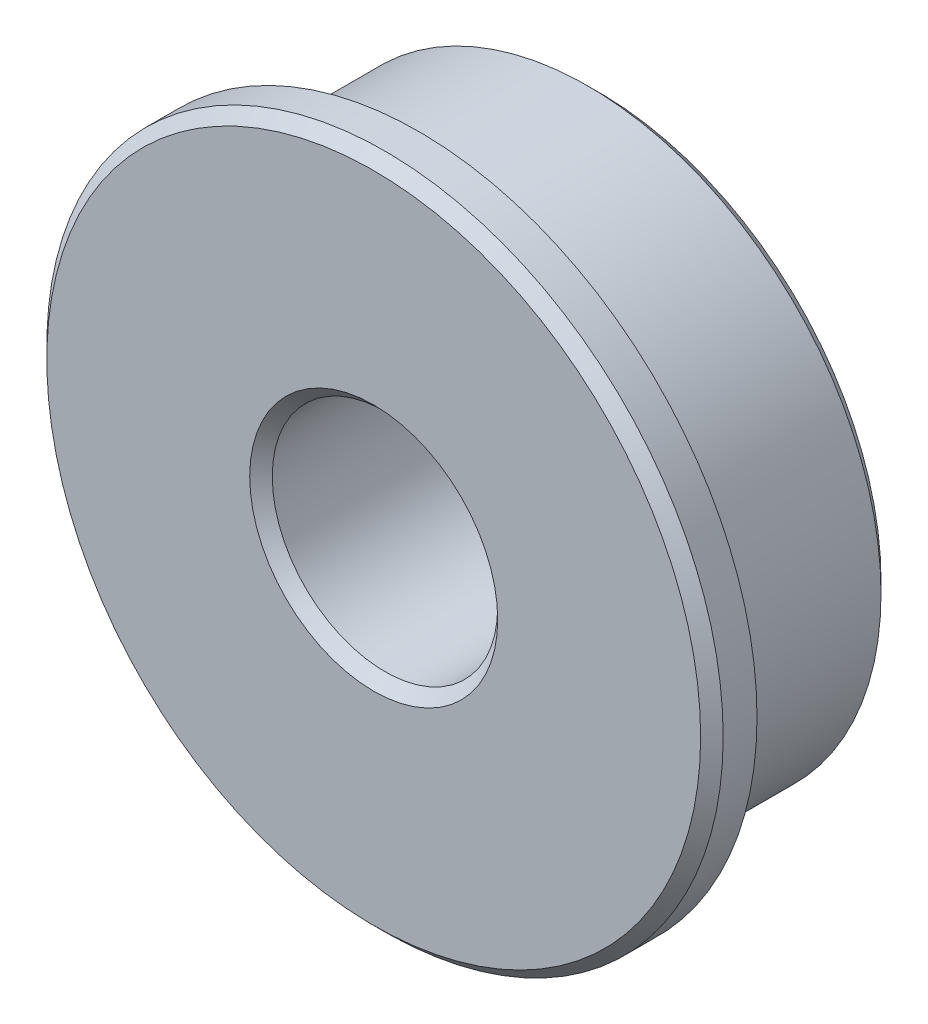
ISO-10303-21;
HEADER;
FILE_DESCRIPTION(('STEP AP214'),'2;1');
FILE_NAME('part.step','',(''),(''),'','','');
FILE_SCHEMA(('AUTOMOTIVE_DESIGN { 1 0 10303 214 1 1 1 1 }'));
ENDSEC;
DATA;
#1=APPLICATION_CONTEXT('core data for automotive mechanical design processes');
#2=APPLICATION_PROTOCOL_DEFINITION('international standard','automotive_design',2000,#1);
#3=PRODUCT_CONTEXT('',#1,'mechanical');
#4=PRODUCT('Part','Part','',(#3));
#5=PRODUCT_RELATED_PRODUCT_CATEGORY('part','',(#4));
#6=PRODUCT_DEFINITION_FORMATION('','',#4);
#7=PRODUCT_DEFINITION_CONTEXT('part definition',#1,'design');
#8=PRODUCT_DEFINITION('design','',#6,#7);
#9=PRODUCT_DEFINITION_SHAPE('','',#8);
#10=(LENGTH_UNIT() NAMED_UNIT(*) SI_UNIT(.MILLI.,.METRE.));
#11=(NAMED_UNIT(*) PLANE_ANGLE_UNIT() SI_UNIT($,.RADIAN.));
#12=(NAMED_UNIT(*) SI_UNIT($,.STERADIAN.) SOLID_ANGLE_UNIT());
#13=UNCERTAINTY_MEASURE_WITH_UNIT(LENGTH_MEASURE(1.E-05),#10,'distance_accuracy_value','');
#14=(GEOMETRIC_REPRESENTATION_CONTEXT(3) GLOBAL_UNCERTAINTY_ASSIGNED_CONTEXT((#13)) GLOBAL_UNIT_ASSIGNED_CONTEXT((#10,
#11,#12)) REPRESENTATION_CONTEXT('',''));
#15=CARTESIAN_POINT('',(0.,0.,0.));
#16=DIRECTION('',(0.,0.,1.));
#17=DIRECTION('',(1.,0.,0.));
#18=AXIS2_PLACEMENT_3D('',#15,#16,#17);
#19=CARTESIAN_POINT('',(0.,0.,5.));
#20=DIRECTION('',(0.,0.,-1.));
#21=DIRECTION('',(-1.,0.,0.));
#22=AXIS2_PLACEMENT_3D('',#19,#20,#21);
#23=CYLINDRICAL_SURFACE('',#22,6.5);
#24=CARTESIAN_POINT('',(0.,0.,0.250000000000003));
#25=DIRECTION('',(0.,0.,1.));
#26=DIRECTION('',(1.,0.,0.));
#27=AXIS2_PLACEMENT_3D('',#24,#25,#26);
#28=CIRCLE('',#27,6.5);
#29=CARTESIAN_POINT('',(6.5,0.,0.250000000000003));
#30=VERTEX_POINT('',#29);
#31=EDGE_CURVE('E38',#30,#30,#28,.T.);
#32=ORIENTED_EDGE('',*,*,#31,.T.);
#33=EDGE_LOOP('',(#32));
#34=FACE_BOUND('',#33,.T.);
#35=CARTESIAN_POINT('',(0.,0.,4.));
#36=DIRECTION('',(0.,0.,1.));
#37=DIRECTION('',(1.,0.,0.));
#38=AXIS2_PLACEMENT_3D('',#35,#36,#37);
#39=CIRCLE('',#38,6.5);
#40=CARTESIAN_POINT('',(6.5,0.,4.));
#41=VERTEX_POINT('',#40);
#42=EDGE_CURVE('E57',#41,#41,#39,.T.);
#43=ORIENTED_EDGE('',*,*,#42,.F.);
#44=EDGE_LOOP('',(#43));
#45=FACE_BOUND('',#44,.T.);
#46=ADVANCED_FACE('F31',(#34,#45),#23,.T.);
#47=CARTESIAN_POINT('',(0.,0.,5.));
#48=DIRECTION('',(0.,0.,1.));
#49=DIRECTION('',(1.,0.,0.));
#50=AXIS2_PLACEMENT_3D('',#47,#48,#49);
#51=PLANE('',#50);
#52=CARTESIAN_POINT('',(0.,0.,5.));
#53=DIRECTION('',(0.,0.,1.));
#54=DIRECTION('',(1.,0.,0.));
#55=AXIS2_PLACEMENT_3D('',#52,#53,#54);
#56=CIRCLE('',#55,2.75000000000001);
#57=CARTESIAN_POINT('',(2.75000000000001,0.,5.));
#58=VERTEX_POINT('',#57);
#59=EDGE_CURVE('E46',#58,#58,#56,.F.);
#60=ORIENTED_EDGE('',*,*,#59,.T.);
#61=EDGE_LOOP('',(#60));
#62=FACE_BOUND('',#61,.T.);
#63=CARTESIAN_POINT('',(0.,0.,5.));
#64=DIRECTION('',(0.,0.,1.));
#65=DIRECTION('',(1.,0.,0.));
#66=AXIS2_PLACEMENT_3D('',#63,#64,#65);
#67=CIRCLE('',#66,7.25);
#68=CARTESIAN_POINT('',(7.25,0.,5.));
#69=VERTEX_POINT('',#68);
#70=EDGE_CURVE('E51',#69,#69,#67,.T.);
#71=ORIENTED_EDGE('',*,*,#70,.T.);
#72=EDGE_LOOP('',(#71));
#73=FACE_BOUND('',#72,.T.);
#74=ADVANCED_FACE('F85',(#62,#73),#51,.T.);
#75=CARTESIAN_POINT('',(0.,0.,0.));
#76=DIRECTION('',(0.,0.,1.));
#77=DIRECTION('',(1.,0.,0.));
#78=AXIS2_PLACEMENT_3D('',#75,#76,#77);
#79=PLANE('',#78);
#80=CARTESIAN_POINT('',(0.,0.,0.));
#81=DIRECTION('',(0.,0.,1.));
#82=DIRECTION('',(1.,0.,0.));
#83=AXIS2_PLACEMENT_3D('',#80,#81,#82);
#84=CIRCLE('',#83,6.25);
#85=CARTESIAN_POINT('',(6.25,0.,0.));
#86=VERTEX_POINT('',#85);
#87=EDGE_CURVE('E10',#86,#86,#84,.F.);
#88=ORIENTED_EDGE('',*,*,#87,.T.);
#89=EDGE_LOOP('',(#88));
#90=FACE_BOUND('',#89,.T.);
#91=CARTESIAN_POINT('',(0.,0.,0.));
#92=DIRECTION('',(0.,0.,1.));
#93=DIRECTION('',(1.,0.,0.));
#94=AXIS2_PLACEMENT_3D('',#91,#92,#93);
#95=CIRCLE('',#94,2.5);
#96=CARTESIAN_POINT('',(2.5,0.,0.));
#97=VERTEX_POINT('',#96);
#98=EDGE_CURVE('E60',#97,#97,#95,.T.);
#99=ORIENTED_EDGE('',*,*,#98,.T.);
#100=EDGE_LOOP('',(#99));
#101=FACE_BOUND('',#100,.T.);
#102=ADVANCED_FACE('F90',(#90,#101),#79,.F.);
#103=CARTESIAN_POINT('',(0.,0.,5.));
#104=DIRECTION('',(0.,0.,-1.));
#105=DIRECTION('',(-1.,0.,0.));
#106=AXIS2_PLACEMENT_3D('',#103,#104,#105);
#107=CYLINDRICAL_SURFACE('',#106,2.5);
#108=CARTESIAN_POINT('',(0.,0.,4.74999999999999));
#109=DIRECTION('',(0.,0.,1.));
#110=DIRECTION('',(1.,0.,0.));
#111=AXIS2_PLACEMENT_3D('',#108,#109,#110);
#112=CIRCLE('',#111,2.5);
#113=CARTESIAN_POINT('',(2.5,0.,4.74999999999999));
#114=VERTEX_POINT('',#113);
#115=EDGE_CURVE('E54',#114,#114,#112,.T.);
#116=ORIENTED_EDGE('',*,*,#115,.T.);
#117=EDGE_LOOP('',(#116));
#118=FACE_BOUND('',#117,.T.);
#119=ORIENTED_EDGE('',*,*,#98,.F.);
#120=EDGE_LOOP('',(#119));
#121=FACE_BOUND('',#120,.T.);
#122=ADVANCED_FACE('F81',(#118,#121),#107,.F.);
#123=CARTESIAN_POINT('',(0.,0.,4.));
#124=DIRECTION('',(0.,0.,1.));
#125=DIRECTION('',(1.,0.,0.));
#126=AXIS2_PLACEMENT_3D('',#123,#124,#125);
#127=CYLINDRICAL_SURFACE('',#126,7.5);
#128=CARTESIAN_POINT('',(0.,0.,4.75));
#129=DIRECTION('',(0.,0.,1.));
#130=DIRECTION('',(1.,0.,0.));
#131=AXIS2_PLACEMENT_3D('',#128,#129,#130);
#132=CIRCLE('',#131,7.5);
#133=CARTESIAN_POINT('',(7.5,0.,4.75));
#134=VERTEX_POINT('',#133);
#135=EDGE_CURVE('E42',#134,#134,#132,.F.);
#136=ORIENTED_EDGE('',*,*,#135,.T.);
#137=EDGE_LOOP('',(#136));
#138=FACE_BOUND('',#137,.T.);
#139=CARTESIAN_POINT('',(0.,0.,4.));
#140=DIRECTION('',(0.,0.,1.));
#141=DIRECTION('',(1.,0.,0.));
#142=AXIS2_PLACEMENT_3D('',#139,#140,#141);
#143=CIRCLE('',#142,7.5);
#144=CARTESIAN_POINT('',(7.5,0.,4.));
#145=VERTEX_POINT('',#144);
#146=EDGE_CURVE('E63',#145,#145,#143,.T.);
#147=ORIENTED_EDGE('',*,*,#146,.T.);
#148=EDGE_LOOP('',(#147));
#149=FACE_BOUND('',#148,.T.);
#150=ADVANCED_FACE('F67',(#138,#149),#127,.T.);
#151=CARTESIAN_POINT('',(0.,0.,4.));
#152=DIRECTION('',(0.,0.,1.));
#153=DIRECTION('',(1.,0.,0.));
#154=AXIS2_PLACEMENT_3D('',#151,#152,#153);
#155=PLANE('',#154);
#156=ORIENTED_EDGE('',*,*,#42,.T.);
#157=EDGE_LOOP('',(#156));
#158=FACE_BOUND('',#157,.T.);
#159=ORIENTED_EDGE('',*,*,#146,.F.);
#160=EDGE_LOOP('',(#159));
#161=FACE_BOUND('',#160,.T.);
#162=ADVANCED_FACE('F69',(#158,#161),#155,.F.);
#163=CARTESIAN_POINT('',(0.,0.,4.74999999999999));
#164=DIRECTION('',(0.,0.,1.));
#165=DIRECTION('',(1.,0.,0.));
#166=AXIS2_PLACEMENT_3D('',#163,#164,#165);
#167=CONICAL_SURFACE('',#166,2.5,0.785398163397449);
#168=ORIENTED_EDGE('',*,*,#59,.F.);
#169=EDGE_LOOP('',(#168));
#170=FACE_BOUND('',#169,.T.);
#171=ORIENTED_EDGE('',*,*,#115,.F.);
#172=EDGE_LOOP('',(#171));
#173=FACE_BOUND('',#172,.T.);
#174=ADVANCED_FACE('F71',(#170,#173),#167,.F.);
#175=CARTESIAN_POINT('',(0.,0.,5.));
#176=DIRECTION('',(0.,0.,-1.));
#177=DIRECTION('',(-1.,0.,0.));
#178=AXIS2_PLACEMENT_3D('',#175,#176,#177);
#179=CONICAL_SURFACE('',#178,7.25,0.785398163397447);
#180=ORIENTED_EDGE('',*,*,#135,.F.);
#181=EDGE_LOOP('',(#180));
#182=FACE_BOUND('',#181,.T.);
#183=ORIENTED_EDGE('',*,*,#70,.F.);
#184=EDGE_LOOP('',(#183));
#185=FACE_BOUND('',#184,.T.);
#186=ADVANCED_FACE('F78',(#182,#185),#179,.T.);
#187=CARTESIAN_POINT('',(0.,0.,0.250000000000003));
#188=DIRECTION('',(0.,0.,1.));
#189=DIRECTION('',(1.,0.,0.));
#190=AXIS2_PLACEMENT_3D('',#187,#188,#189);
#191=CONICAL_SURFACE('',#190,6.5,0.78539816339745);
#192=ORIENTED_EDGE('',*,*,#87,.F.);
#193=EDGE_LOOP('',(#192));
#194=FACE_BOUND('',#193,.T.);
#195=ORIENTED_EDGE('',*,*,#31,.F.);
#196=EDGE_LOOP('',(#195));
#197=FACE_BOUND('',#196,.T.);
#198=ADVANCED_FACE('F33',(#194,#197),#191,.T.);
#199=CLOSED_SHELL('',(#46,#74,#102,#122,#150,#162,#174,#186,#198));
#200=MANIFOLD_SOLID_BREP('B2',#199);
#201=ADVANCED_BREP_SHAPE_REPRESENTATION('',(#18,#200),#14);
#202=SHAPE_DEFINITION_REPRESENTATION(#9,#201);
ENDSEC;
END-ISO-10303-21;
